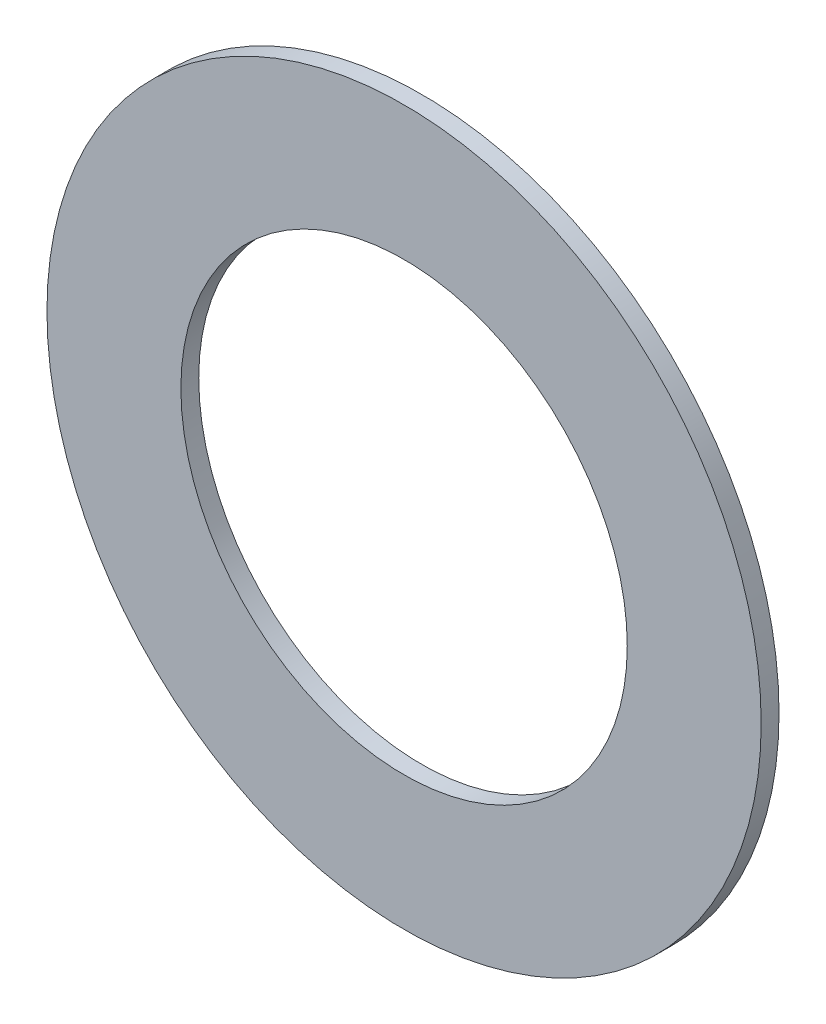
ISO-10303-21;
HEADER;
FILE_DESCRIPTION(('STEP AP214'),'2;1');
FILE_NAME('part.step','',(''),(''),'','','');
FILE_SCHEMA(('AUTOMOTIVE_DESIGN { 1 0 10303 214 1 1 1 1 }'));
ENDSEC;
DATA;
#1=APPLICATION_CONTEXT('core data for automotive mechanical design processes');
#2=APPLICATION_PROTOCOL_DEFINITION('international standard','automotive_design',2000,#1);
#3=PRODUCT_CONTEXT('',#1,'mechanical');
#4=PRODUCT('Part','Part','',(#3));
#5=PRODUCT_RELATED_PRODUCT_CATEGORY('part','',(#4));
#6=PRODUCT_DEFINITION_FORMATION('','',#4);
#7=PRODUCT_DEFINITION_CONTEXT('part definition',#1,'design');
#8=PRODUCT_DEFINITION('design','',#6,#7);
#9=PRODUCT_DEFINITION_SHAPE('','',#8);
#10=(LENGTH_UNIT() NAMED_UNIT(*) SI_UNIT(.MILLI.,.METRE.));
#11=(NAMED_UNIT(*) PLANE_ANGLE_UNIT() SI_UNIT($,.RADIAN.));
#12=(NAMED_UNIT(*) SI_UNIT($,.STERADIAN.) SOLID_ANGLE_UNIT());
#13=UNCERTAINTY_MEASURE_WITH_UNIT(LENGTH_MEASURE(1.E-05),#10,'distance_accuracy_value','');
#14=(GEOMETRIC_REPRESENTATION_CONTEXT(3) GLOBAL_UNCERTAINTY_ASSIGNED_CONTEXT((#13)) GLOBAL_UNIT_ASSIGNED_CONTEXT((#10,
#11,#12)) REPRESENTATION_CONTEXT('',''));
#15=CARTESIAN_POINT('',(0.,0.,0.));
#16=DIRECTION('',(0.,0.,1.));
#17=DIRECTION('',(1.,0.,0.));
#18=AXIS2_PLACEMENT_3D('',#15,#16,#17);
#19=CARTESIAN_POINT('',(0.,0.,-4.));
#20=DIRECTION('',(0.,0.,1.));
#21=DIRECTION('',(1.,0.,0.));
#22=AXIS2_PLACEMENT_3D('',#19,#20,#21);
#23=PLANE('',#22);
#24=CARTESIAN_POINT('',(0.,0.,-4.));
#25=DIRECTION('',(0.,0.,1.));
#26=DIRECTION('',(1.,0.,0.));
#27=AXIS2_PLACEMENT_3D('',#24,#25,#26);
#28=CIRCLE('',#27,2.5);
#29=CARTESIAN_POINT('',(2.5,0.,-4.));
#30=VERTEX_POINT('',#29);
#31=EDGE_CURVE('E26',#30,#30,#28,.T.);
#32=ORIENTED_EDGE('',*,*,#31,.T.);
#33=EDGE_LOOP('',(#32));
#34=FACE_BOUND('',#33,.T.);
#35=CARTESIAN_POINT('',(0.,0.,-4.));
#36=DIRECTION('',(0.,0.,1.));
#37=DIRECTION('',(1.,0.,0.));
#38=AXIS2_PLACEMENT_3D('',#35,#36,#37);
#39=CIRCLE('',#38,4.);
#40=CARTESIAN_POINT('',(4.,0.,-4.));
#41=VERTEX_POINT('',#40);
#42=EDGE_CURVE('E17',#41,#41,#39,.T.);
#43=ORIENTED_EDGE('',*,*,#42,.F.);
#44=EDGE_LOOP('',(#43));
#45=FACE_BOUND('',#44,.T.);
#46=ADVANCED_FACE('F14',(#34,#45),#23,.F.);
#47=CARTESIAN_POINT('',(0.,0.,-4.));
#48=DIRECTION('',(0.,0.,1.));
#49=DIRECTION('',(1.,0.,0.));
#50=AXIS2_PLACEMENT_3D('',#47,#48,#49);
#51=CYLINDRICAL_SURFACE('',#50,4.);
#52=ORIENTED_EDGE('',*,*,#42,.T.);
#53=EDGE_LOOP('',(#52));
#54=FACE_BOUND('',#53,.T.);
#55=CARTESIAN_POINT('',(0.,0.,-3.8));
#56=DIRECTION('',(0.,0.,1.));
#57=DIRECTION('',(1.,0.,0.));
#58=AXIS2_PLACEMENT_3D('',#55,#56,#57);
#59=CIRCLE('',#58,4.);
#60=CARTESIAN_POINT('',(4.,0.,-3.8));
#61=VERTEX_POINT('',#60);
#62=EDGE_CURVE('E21',#61,#61,#59,.T.);
#63=ORIENTED_EDGE('',*,*,#62,.F.);
#64=EDGE_LOOP('',(#63));
#65=FACE_BOUND('',#64,.T.);
#66=ADVANCED_FACE('F34',(#54,#65),#51,.T.);
#67=CARTESIAN_POINT('',(0.,0.,-4.));
#68=DIRECTION('',(0.,0.,1.));
#69=DIRECTION('',(1.,0.,0.));
#70=AXIS2_PLACEMENT_3D('',#67,#68,#69);
#71=CYLINDRICAL_SURFACE('',#70,2.5);
#72=ORIENTED_EDGE('',*,*,#31,.F.);
#73=EDGE_LOOP('',(#72));
#74=FACE_BOUND('',#73,.T.);
#75=CARTESIAN_POINT('',(0.,0.,-3.8));
#76=DIRECTION('',(0.,0.,1.));
#77=DIRECTION('',(1.,0.,0.));
#78=AXIS2_PLACEMENT_3D('',#75,#76,#77);
#79=CIRCLE('',#78,2.5);
#80=CARTESIAN_POINT('',(2.5,0.,-3.8));
#81=VERTEX_POINT('',#80);
#82=EDGE_CURVE('E9',#81,#81,#79,.F.);
#83=ORIENTED_EDGE('',*,*,#82,.F.);
#84=EDGE_LOOP('',(#83));
#85=FACE_BOUND('',#84,.T.);
#86=ADVANCED_FACE('F42',(#74,#85),#71,.F.);
#87=CARTESIAN_POINT('',(0.,0.,-3.8));
#88=DIRECTION('',(0.,0.,1.));
#89=DIRECTION('',(1.,0.,0.));
#90=AXIS2_PLACEMENT_3D('',#87,#88,#89);
#91=PLANE('',#90);
#92=ORIENTED_EDGE('',*,*,#82,.T.);
#93=EDGE_LOOP('',(#92));
#94=FACE_BOUND('',#93,.T.);
#95=ORIENTED_EDGE('',*,*,#62,.T.);
#96=EDGE_LOOP('',(#95));
#97=FACE_BOUND('',#96,.T.);
#98=ADVANCED_FACE('F43',(#94,#97),#91,.T.);
#99=CLOSED_SHELL('',(#46,#66,#86,#98));
#100=MANIFOLD_SOLID_BREP('B1',#99);
#101=ADVANCED_BREP_SHAPE_REPRESENTATION('',(#18,#100),#14);
#102=SHAPE_DEFINITION_REPRESENTATION(#9,#101);
ENDSEC;
END-ISO-10303-21;
